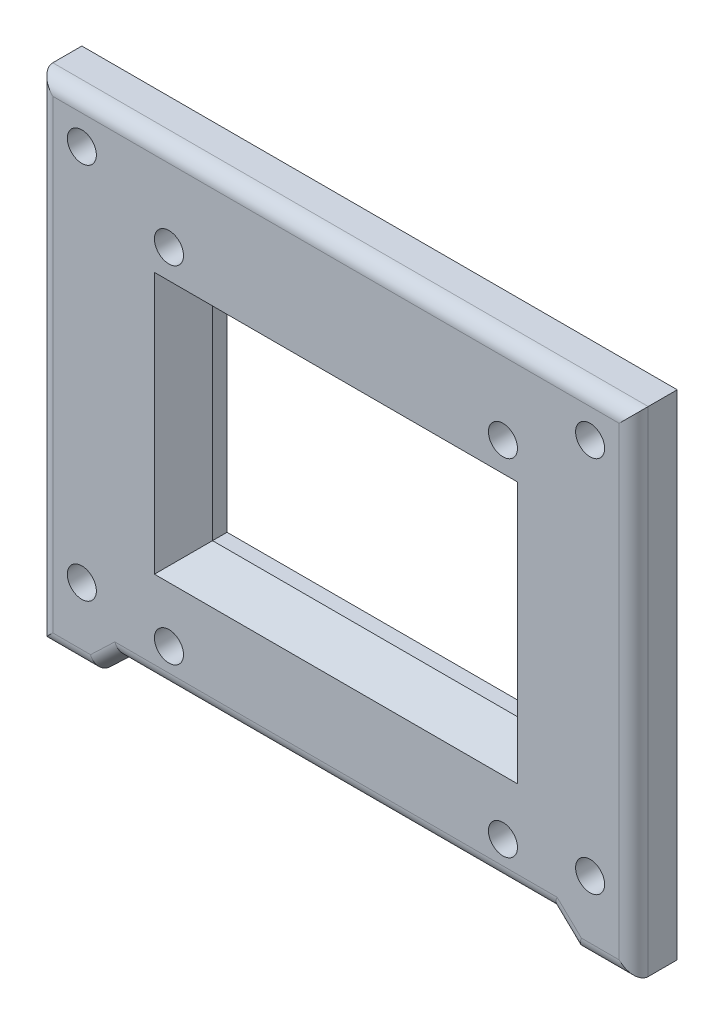
ISO-10303-21;
HEADER;
FILE_DESCRIPTION(('STEP AP214'),'2;1');
FILE_NAME('part.step','',(''),(''),'','','');
FILE_SCHEMA(('AUTOMOTIVE_DESIGN { 1 0 10303 214 1 1 1 1 }'));
ENDSEC;
DATA;
#1=APPLICATION_CONTEXT('core data for automotive mechanical design processes');
#2=APPLICATION_PROTOCOL_DEFINITION('international standard','automotive_design',2000,#1);
#3=PRODUCT_CONTEXT('',#1,'mechanical');
#4=PRODUCT('Part','Part','',(#3));
#5=PRODUCT_RELATED_PRODUCT_CATEGORY('part','',(#4));
#6=PRODUCT_DEFINITION_FORMATION('','',#4);
#7=PRODUCT_DEFINITION_CONTEXT('part definition',#1,'design');
#8=PRODUCT_DEFINITION('design','',#6,#7);
#9=PRODUCT_DEFINITION_SHAPE('','',#8);
#10=(LENGTH_UNIT() NAMED_UNIT(*) SI_UNIT(.MILLI.,.METRE.));
#11=(NAMED_UNIT(*) PLANE_ANGLE_UNIT() SI_UNIT($,.RADIAN.));
#12=(NAMED_UNIT(*) SI_UNIT($,.STERADIAN.) SOLID_ANGLE_UNIT());
#13=UNCERTAINTY_MEASURE_WITH_UNIT(LENGTH_MEASURE(1.E-05),#10,'distance_accuracy_value','');
#14=(GEOMETRIC_REPRESENTATION_CONTEXT(3) GLOBAL_UNCERTAINTY_ASSIGNED_CONTEXT((#13)) GLOBAL_UNIT_ASSIGNED_CONTEXT((#10,
#11,#12)) REPRESENTATION_CONTEXT('',''));
#15=CARTESIAN_POINT('',(0.,0.,0.));
#16=DIRECTION('',(0.,0.,1.));
#17=DIRECTION('',(1.,0.,0.));
#18=AXIS2_PLACEMENT_3D('',#15,#16,#17);
#19=CARTESIAN_POINT('',(0.,0.,3.));
#20=DIRECTION('',(0.,0.,1.));
#21=DIRECTION('',(1.,0.,0.));
#22=AXIS2_PLACEMENT_3D('',#19,#20,#21);
#23=PLANE('',#22);
#24=CARTESIAN_POINT('',(-18.4283511042773,-4.09303737255482,3.));
#25=DIRECTION('',(0.,0.,1.));
#26=DIRECTION('',(1.,0.,0.));
#27=AXIS2_PLACEMENT_3D('',#24,#25,#26);
#28=CIRCLE('',#27,1.);
#29=CARTESIAN_POINT('',(-17.4283511042773,-4.09303737255482,3.));
#30=VERTEX_POINT('',#29);
#31=EDGE_CURVE('E772',#30,#30,#28,.T.);
#32=ORIENTED_EDGE('',*,*,#31,.F.);
#33=EDGE_LOOP('',(#32));
#34=FACE_BOUND('',#33,.T.);
#35=CARTESIAN_POINT('',(16.5716488957227,21.9069626274452,3.));
#36=DIRECTION('',(0.,0.,1.));
#37=DIRECTION('',(1.,0.,0.));
#38=AXIS2_PLACEMENT_3D('',#35,#36,#37);
#39=CIRCLE('',#38,1.);
#40=CARTESIAN_POINT('',(17.5716488957227,21.9069626274452,3.));
#41=VERTEX_POINT('',#40);
#42=EDGE_CURVE('E781',#41,#41,#39,.T.);
#43=ORIENTED_EDGE('',*,*,#42,.F.);
#44=EDGE_LOOP('',(#43));
#45=FACE_BOUND('',#44,.T.);
#46=CARTESIAN_POINT('',(16.5716488957227,-4.09303737255482,3.));
#47=DIRECTION('',(0.,0.,1.));
#48=DIRECTION('',(1.,0.,0.));
#49=AXIS2_PLACEMENT_3D('',#46,#47,#48);
#50=CIRCLE('',#49,1.);
#51=CARTESIAN_POINT('',(17.5716488957227,-4.09303737255482,3.));
#52=VERTEX_POINT('',#51);
#53=EDGE_CURVE('E847',#52,#52,#50,.T.);
#54=ORIENTED_EDGE('',*,*,#53,.F.);
#55=EDGE_LOOP('',(#54));
#56=FACE_BOUND('',#55,.T.);
#57=CARTESIAN_POINT('',(-18.4283511042773,21.9069626274452,3.));
#58=DIRECTION('',(0.,0.,1.));
#59=DIRECTION('',(1.,0.,0.));
#60=AXIS2_PLACEMENT_3D('',#57,#58,#59);
#61=CIRCLE('',#60,1.);
#62=CARTESIAN_POINT('',(-17.4283511042773,21.9069626274452,3.));
#63=VERTEX_POINT('',#62);
#64=EDGE_CURVE('E778',#63,#63,#61,.T.);
#65=ORIENTED_EDGE('',*,*,#64,.F.);
#66=EDGE_LOOP('',(#65));
#67=FACE_BOUND('',#66,.T.);
#68=DIRECTION('',(0.722490361505851,0.691380993035783,0.));
#69=VECTOR('',#68,1.);
#70=CARTESIAN_POINT('',(-16.4477385220579,-6.77054701104897,3.));
#71=LINE('',#70,#69);
#72=CARTESIAN_POINT('',(-17.8297356394171,-8.09303737255482,3.));
#73=VERTEX_POINT('',#72);
#74=CARTESIAN_POINT('',(-16.1577420641619,-6.49303737255482,3.));
#75=VERTEX_POINT('',#74);
#76=EDGE_CURVE('E325',#73,#75,#71,.T.);
#77=ORIENTED_EDGE('',*,*,#76,.T.);
#78=DIRECTION('',(1.,0.,0.));
#79=VECTOR('',#78,1.);
#80=CARTESIAN_POINT('',(13.8996553204676,-6.49303737255482,3.));
#81=LINE('',#80,#79);
#82=CARTESIAN_POINT('',(14.3010398556073,-6.49303737255482,3.));
#83=VERTEX_POINT('',#82);
#84=EDGE_CURVE('E332',#75,#83,#81,.T.);
#85=ORIENTED_EDGE('',*,*,#84,.T.);
#86=DIRECTION('',(0.722490361505851,-0.691380993035783,0.));
#87=VECTOR('',#86,1.);
#88=CARTESIAN_POINT('',(16.2630298887585,-8.37054701104897,3.));
#89=LINE('',#88,#87);
#90=CARTESIAN_POINT('',(15.9730334308625,-8.09303737255482,3.));
#91=VERTEX_POINT('',#90);
#92=EDGE_CURVE('E328',#83,#91,#89,.T.);
#93=ORIENTED_EDGE('',*,*,#92,.T.);
#94=DIRECTION('',(1.,0.,0.));
#95=VECTOR('',#94,1.);
#96=CARTESIAN_POINT('',(19.5716488957227,-8.09303737255483,3.));
#97=LINE('',#96,#95);
#98=CARTESIAN_POINT('',(18.5716488957227,-8.09303737255483,3.));
#99=VERTEX_POINT('',#98);
#100=EDGE_CURVE('E319',#91,#99,#97,.T.);
#101=ORIENTED_EDGE('',*,*,#100,.T.);
#102=DIRECTION('',(0.,1.,0.));
#103=VECTOR('',#102,1.);
#104=CARTESIAN_POINT('',(18.5716488957227,24.9069626274452,3.));
#105=LINE('',#104,#103);
#106=CARTESIAN_POINT('',(18.5716488957227,23.9069626274452,3.));
#107=VERTEX_POINT('',#106);
#108=EDGE_CURVE('E316',#99,#107,#105,.T.);
#109=ORIENTED_EDGE('',*,*,#108,.T.);
#110=DIRECTION('',(-1.,0.,0.));
#111=VECTOR('',#110,1.);
#112=CARTESIAN_POINT('',(-21.4283511042773,23.9069626274452,3.));
#113=LINE('',#112,#111);
#114=CARTESIAN_POINT('',(-20.4283511042773,23.9069626274452,3.));
#115=VERTEX_POINT('',#114);
#116=EDGE_CURVE('E313',#107,#115,#113,.T.);
#117=ORIENTED_EDGE('',*,*,#116,.T.);
#118=DIRECTION('',(0.,-1.,0.));
#119=VECTOR('',#118,1.);
#120=CARTESIAN_POINT('',(-20.4283511042773,-9.09303737255483,3.));
#121=LINE('',#120,#119);
#122=CARTESIAN_POINT('',(-20.4283511042773,-8.09303737255483,3.));
#123=VERTEX_POINT('',#122);
#124=EDGE_CURVE('E295',#115,#123,#121,.T.);
#125=ORIENTED_EDGE('',*,*,#124,.T.);
#126=DIRECTION('',(1.,0.,0.));
#127=VECTOR('',#126,1.);
#128=CARTESIAN_POINT('',(-17.4283511042773,-8.09303737255482,3.));
#129=LINE('',#128,#127);
#130=EDGE_CURVE('E322',#123,#73,#129,.T.);
#131=ORIENTED_EDGE('',*,*,#130,.T.);
#132=EDGE_LOOP('',(#77,#85,#93,#101,#109,#117,#125,#131));
#133=FACE_BOUND('',#132,.T.);
#134=DIRECTION('',(-1.,0.,0.));
#135=VECTOR('',#134,1.);
#136=CARTESIAN_POINT('',(0.,-1.09303737255483,3.));
#137=LINE('',#136,#135);
#138=CARTESIAN_POINT('',(11.5716488957227,-1.09303737255483,3.));
#139=VERTEX_POINT('',#138);
#140=CARTESIAN_POINT('',(-13.4283511042773,-1.09303737255483,3.));
#141=VERTEX_POINT('',#140);
#142=EDGE_CURVE('E273',#139,#141,#137,.T.);
#143=ORIENTED_EDGE('',*,*,#142,.T.);
#144=DIRECTION('',(0.,1.,0.));
#145=VECTOR('',#144,1.);
#146=CARTESIAN_POINT('',(-13.4283511042773,0.,3.));
#147=LINE('',#146,#145);
#148=CARTESIAN_POINT('',(-13.4283511042773,16.9069626274452,3.));
#149=VERTEX_POINT('',#148);
#150=EDGE_CURVE('E282',#141,#149,#147,.T.);
#151=ORIENTED_EDGE('',*,*,#150,.T.);
#152=DIRECTION('',(1.,0.,0.));
#153=VECTOR('',#152,1.);
#154=CARTESIAN_POINT('',(0.,16.9069626274452,3.));
#155=LINE('',#154,#153);
#156=CARTESIAN_POINT('',(11.5716488957227,16.9069626274452,3.));
#157=VERTEX_POINT('',#156);
#158=EDGE_CURVE('E279',#149,#157,#155,.T.);
#159=ORIENTED_EDGE('',*,*,#158,.T.);
#160=DIRECTION('',(0.,-1.,0.));
#161=VECTOR('',#160,1.);
#162=CARTESIAN_POINT('',(11.5716488957227,0.,3.));
#163=LINE('',#162,#161);
#164=EDGE_CURVE('E276',#157,#139,#163,.T.);
#165=ORIENTED_EDGE('',*,*,#164,.T.);
#166=EDGE_LOOP('',(#143,#151,#159,#165));
#167=FACE_BOUND('',#166,.T.);
#168=CARTESIAN_POINT('',(10.5716488957227,18.9069626274452,3.));
#169=DIRECTION('',(0.,0.,1.));
#170=DIRECTION('',(1.,0.,0.));
#171=AXIS2_PLACEMENT_3D('',#168,#169,#170);
#172=CIRCLE('',#171,1.);
#173=CARTESIAN_POINT('',(11.5716488957227,18.9069626274452,3.));
#174=VERTEX_POINT('',#173);
#175=EDGE_CURVE('E803',#174,#174,#172,.T.);
#176=ORIENTED_EDGE('',*,*,#175,.F.);
#177=EDGE_LOOP('',(#176));
#178=FACE_BOUND('',#177,.T.);
#179=CARTESIAN_POINT('',(-12.4283511042773,18.9069626274452,3.));
#180=DIRECTION('',(0.,0.,1.));
#181=DIRECTION('',(1.,0.,0.));
#182=AXIS2_PLACEMENT_3D('',#179,#180,#181);
#183=CIRCLE('',#182,1.);
#184=CARTESIAN_POINT('',(-11.4283511042773,18.9069626274452,3.));
#185=VERTEX_POINT('',#184);
#186=EDGE_CURVE('E196',#185,#185,#183,.T.);
#187=ORIENTED_EDGE('',*,*,#186,.F.);
#188=EDGE_LOOP('',(#187));
#189=FACE_BOUND('',#188,.T.);
#190=CARTESIAN_POINT('',(-12.4283511042773,-4.89303737255482,3.));
#191=DIRECTION('',(0.,0.,1.));
#192=DIRECTION('',(1.,0.,0.));
#193=AXIS2_PLACEMENT_3D('',#190,#191,#192);
#194=CIRCLE('',#193,1.);
#195=CARTESIAN_POINT('',(-11.4283511042773,-4.89303737255482,3.));
#196=VERTEX_POINT('',#195);
#197=EDGE_CURVE('E811',#196,#196,#194,.T.);
#198=ORIENTED_EDGE('',*,*,#197,.F.);
#199=EDGE_LOOP('',(#198));
#200=FACE_BOUND('',#199,.T.);
#201=CARTESIAN_POINT('',(10.5716488957227,-4.89303737255482,3.));
#202=DIRECTION('',(0.,0.,1.));
#203=DIRECTION('',(1.,0.,0.));
#204=AXIS2_PLACEMENT_3D('',#201,#202,#203);
#205=CIRCLE('',#204,1.);
#206=CARTESIAN_POINT('',(11.5716488957227,-4.89303737255482,3.));
#207=VERTEX_POINT('',#206);
#208=EDGE_CURVE('E795',#207,#207,#205,.T.);
#209=ORIENTED_EDGE('',*,*,#208,.F.);
#210=EDGE_LOOP('',(#209));
#211=FACE_BOUND('',#210,.T.);
#212=ADVANCED_FACE('F40',(#34,#45,#56,#67,#133,#167,#178,#189,#200,#211),#23,.T.);
#213=CARTESIAN_POINT('',(0.,0.,0.));
#214=DIRECTION('',(0.,0.,1.));
#215=DIRECTION('',(1.,0.,0.));
#216=AXIS2_PLACEMENT_3D('',#213,#214,#215);
#217=PLANE('',#216);
#218=CARTESIAN_POINT('',(-18.4283511042773,-4.09303737255482,0.));
#219=DIRECTION('',(0.,0.,1.));
#220=DIRECTION('',(1.,0.,0.));
#221=AXIS2_PLACEMENT_3D('',#218,#219,#220);
#222=CIRCLE('',#221,1.);
#223=CARTESIAN_POINT('',(-17.4283511042773,-4.09303737255482,0.));
#224=VERTEX_POINT('',#223);
#225=EDGE_CURVE('E770',#224,#224,#222,.T.);
#226=ORIENTED_EDGE('',*,*,#225,.T.);
#227=EDGE_LOOP('',(#226));
#228=FACE_BOUND('',#227,.T.);
#229=CARTESIAN_POINT('',(16.5716488957227,21.9069626274452,0.));
#230=DIRECTION('',(0.,0.,1.));
#231=DIRECTION('',(1.,0.,0.));
#232=AXIS2_PLACEMENT_3D('',#229,#230,#231);
#233=CIRCLE('',#232,1.);
#234=CARTESIAN_POINT('',(17.5716488957227,21.9069626274452,0.));
#235=VERTEX_POINT('',#234);
#236=EDGE_CURVE('E774',#235,#235,#233,.T.);
#237=ORIENTED_EDGE('',*,*,#236,.T.);
#238=EDGE_LOOP('',(#237));
#239=FACE_BOUND('',#238,.T.);
#240=CARTESIAN_POINT('',(16.5716488957227,-4.09303737255482,0.));
#241=DIRECTION('',(0.,0.,1.));
#242=DIRECTION('',(1.,0.,0.));
#243=AXIS2_PLACEMENT_3D('',#240,#241,#242);
#244=CIRCLE('',#243,1.);
#245=CARTESIAN_POINT('',(17.5716488957227,-4.09303737255482,0.));
#246=VERTEX_POINT('',#245);
#247=EDGE_CURVE('E788',#246,#246,#244,.T.);
#248=ORIENTED_EDGE('',*,*,#247,.T.);
#249=EDGE_LOOP('',(#248));
#250=FACE_BOUND('',#249,.T.);
#251=CARTESIAN_POINT('',(-18.4283511042773,21.9069626274452,0.));
#252=DIRECTION('',(0.,0.,1.));
#253=DIRECTION('',(1.,0.,0.));
#254=AXIS2_PLACEMENT_3D('',#251,#252,#253);
#255=CIRCLE('',#254,1.);
#256=CARTESIAN_POINT('',(-17.4283511042773,21.9069626274452,0.));
#257=VERTEX_POINT('',#256);
#258=EDGE_CURVE('E360',#257,#257,#255,.T.);
#259=ORIENTED_EDGE('',*,*,#258,.T.);
#260=EDGE_LOOP('',(#259));
#261=FACE_BOUND('',#260,.T.);
#262=DIRECTION('',(0.,-1.,0.));
#263=VECTOR('',#262,1.);
#264=CARTESIAN_POINT('',(-21.4283511042773,24.9069626274452,0.));
#265=LINE('',#264,#263);
#266=CARTESIAN_POINT('',(-21.4283511042773,24.9069626274452,0.));
#267=VERTEX_POINT('',#266);
#268=CARTESIAN_POINT('',(-21.4283511042773,-9.09303737255483,0.));
#269=VERTEX_POINT('',#268);
#270=EDGE_CURVE('E178',#267,#269,#265,.T.);
#271=ORIENTED_EDGE('',*,*,#270,.F.);
#272=DIRECTION('',(-1.,0.,0.));
#273=VECTOR('',#272,1.);
#274=CARTESIAN_POINT('',(-21.4283511042773,24.9069626274452,0.));
#275=LINE('',#274,#273);
#276=CARTESIAN_POINT('',(19.5716488957227,24.9069626274452,0.));
#277=VERTEX_POINT('',#276);
#278=EDGE_CURVE('E243',#277,#267,#275,.T.);
#279=ORIENTED_EDGE('',*,*,#278,.F.);
#280=DIRECTION('',(0.,1.,0.));
#281=VECTOR('',#280,1.);
#282=CARTESIAN_POINT('',(19.5716488957227,24.9069626274452,0.));
#283=LINE('',#282,#281);
#284=CARTESIAN_POINT('',(19.5716488957227,-9.09303737255483,0.));
#285=VERTEX_POINT('',#284);
#286=EDGE_CURVE('E239',#285,#277,#283,.T.);
#287=ORIENTED_EDGE('',*,*,#286,.F.);
#288=DIRECTION('',(1.,0.,0.));
#289=VECTOR('',#288,1.);
#290=CARTESIAN_POINT('',(17.6967719504283,-9.09303737255482,0.));
#291=LINE('',#290,#289);
#292=CARTESIAN_POINT('',(15.5716488957227,-9.09303737255482,0.));
#293=VERTEX_POINT('',#292);
#294=EDGE_CURVE('E235',#293,#285,#291,.T.);
#295=ORIENTED_EDGE('',*,*,#294,.F.);
#296=DIRECTION('',(0.722490361505851,-0.691380993035783,0.));
#297=VECTOR('',#296,1.);
#298=CARTESIAN_POINT('',(15.5716488957227,-9.09303737255482,0.));
#299=LINE('',#298,#297);
#300=CARTESIAN_POINT('',(13.8996553204676,-7.49303737255482,0.));
#301=VERTEX_POINT('',#300);
#302=EDGE_CURVE('E231',#301,#293,#299,.T.);
#303=ORIENTED_EDGE('',*,*,#302,.F.);
#304=DIRECTION('',(1.,0.,0.));
#305=VECTOR('',#304,1.);
#306=CARTESIAN_POINT('',(-15.7563575290221,-7.49303737255482,0.));
#307=LINE('',#306,#305);
#308=CARTESIAN_POINT('',(-15.7563575290221,-7.49303737255482,0.));
#309=VERTEX_POINT('',#308);
#310=EDGE_CURVE('E227',#309,#301,#307,.T.);
#311=ORIENTED_EDGE('',*,*,#310,.F.);
#312=DIRECTION('',(0.722490361505851,0.691380993035783,0.));
#313=VECTOR('',#312,1.);
#314=CARTESIAN_POINT('',(-17.4283511042773,-9.09303737255482,0.));
#315=LINE('',#314,#313);
#316=CARTESIAN_POINT('',(-17.4283511042773,-9.09303737255482,0.));
#317=VERTEX_POINT('',#316);
#318=EDGE_CURVE('E223',#317,#309,#315,.T.);
#319=ORIENTED_EDGE('',*,*,#318,.F.);
#320=DIRECTION('',(1.,0.,0.));
#321=VECTOR('',#320,1.);
#322=CARTESIAN_POINT('',(-21.4283511042773,-9.09303737255483,0.));
#323=LINE('',#322,#321);
#324=EDGE_CURVE('E219',#269,#317,#323,.T.);
#325=ORIENTED_EDGE('',*,*,#324,.F.);
#326=EDGE_LOOP('',(#271,#279,#287,#295,#303,#311,#319,#325));
#327=FACE_BOUND('',#326,.T.);
#328=DIRECTION('',(0.,-1.,0.));
#329=VECTOR('',#328,1.);
#330=CARTESIAN_POINT('',(-11.4283511042773,14.9069626274452,0.));
#331=LINE('',#330,#329);
#332=CARTESIAN_POINT('',(-11.4283511042773,14.9069626274452,0.));
#333=VERTEX_POINT('',#332);
#334=CARTESIAN_POINT('',(-11.4283511042773,0.906962627445175,0.));
#335=VERTEX_POINT('',#334);
#336=EDGE_CURVE('E172',#333,#335,#331,.T.);
#337=ORIENTED_EDGE('',*,*,#336,.T.);
#338=DIRECTION('',(1.,0.,0.));
#339=VECTOR('',#338,1.);
#340=CARTESIAN_POINT('',(-11.4283511042773,0.906962627445175,0.));
#341=LINE('',#340,#339);
#342=CARTESIAN_POINT('',(9.57164889572272,0.906962627445175,0.));
#343=VERTEX_POINT('',#342);
#344=EDGE_CURVE('E182',#335,#343,#341,.T.);
#345=ORIENTED_EDGE('',*,*,#344,.T.);
#346=DIRECTION('',(0.,1.,0.));
#347=VECTOR('',#346,1.);
#348=CARTESIAN_POINT('',(9.57164889572272,14.9069626274452,0.));
#349=LINE('',#348,#347);
#350=CARTESIAN_POINT('',(9.57164889572272,14.9069626274452,0.));
#351=VERTEX_POINT('',#350);
#352=EDGE_CURVE('E189',#343,#351,#349,.T.);
#353=ORIENTED_EDGE('',*,*,#352,.T.);
#354=DIRECTION('',(-1.,0.,0.));
#355=VECTOR('',#354,1.);
#356=CARTESIAN_POINT('',(-11.4283511042773,14.9069626274452,0.));
#357=LINE('',#356,#355);
#358=EDGE_CURVE('E194',#351,#333,#357,.T.);
#359=ORIENTED_EDGE('',*,*,#358,.T.);
#360=EDGE_LOOP('',(#337,#345,#353,#359));
#361=FACE_BOUND('',#360,.T.);
#362=CARTESIAN_POINT('',(-12.4283511042773,18.9069626274452,0.));
#363=DIRECTION('',(0.,0.,1.));
#364=DIRECTION('',(1.,0.,0.));
#365=AXIS2_PLACEMENT_3D('',#362,#363,#364);
#366=CIRCLE('',#365,1.);
#367=CARTESIAN_POINT('',(-11.4283511042773,18.9069626274452,0.));
#368=VERTEX_POINT('',#367);
#369=EDGE_CURVE('E200',#368,#368,#366,.T.);
#370=ORIENTED_EDGE('',*,*,#369,.T.);
#371=EDGE_LOOP('',(#370));
#372=FACE_BOUND('',#371,.T.);
#373=CARTESIAN_POINT('',(-12.4283511042773,-4.89303737255482,0.));
#374=DIRECTION('',(0.,0.,1.));
#375=DIRECTION('',(1.,0.,0.));
#376=AXIS2_PLACEMENT_3D('',#373,#374,#375);
#377=CIRCLE('',#376,1.);
#378=CARTESIAN_POINT('',(-11.4283511042773,-4.89303737255482,0.));
#379=VERTEX_POINT('',#378);
#380=EDGE_CURVE('E807',#379,#379,#377,.T.);
#381=ORIENTED_EDGE('',*,*,#380,.T.);
#382=EDGE_LOOP('',(#381));
#383=FACE_BOUND('',#382,.T.);
#384=CARTESIAN_POINT('',(10.5716488957227,18.9069626274452,0.));
#385=DIRECTION('',(0.,0.,1.));
#386=DIRECTION('',(1.,0.,0.));
#387=AXIS2_PLACEMENT_3D('',#384,#385,#386);
#388=CIRCLE('',#387,1.);
#389=CARTESIAN_POINT('',(11.5716488957227,18.9069626274452,0.));
#390=VERTEX_POINT('',#389);
#391=EDGE_CURVE('E799',#390,#390,#388,.T.);
#392=ORIENTED_EDGE('',*,*,#391,.T.);
#393=EDGE_LOOP('',(#392));
#394=FACE_BOUND('',#393,.T.);
#395=CARTESIAN_POINT('',(10.5716488957227,-4.89303737255482,0.));
#396=DIRECTION('',(0.,0.,1.));
#397=DIRECTION('',(1.,0.,0.));
#398=AXIS2_PLACEMENT_3D('',#395,#396,#397);
#399=CIRCLE('',#398,1.);
#400=CARTESIAN_POINT('',(11.5716488957227,-4.89303737255482,0.));
#401=VERTEX_POINT('',#400);
#402=EDGE_CURVE('E310',#401,#401,#399,.T.);
#403=ORIENTED_EDGE('',*,*,#402,.T.);
#404=EDGE_LOOP('',(#403));
#405=FACE_BOUND('',#404,.T.);
#406=ADVANCED_FACE('F191',(#228,#239,#250,#261,#327,#361,#372,#383,#394,#405),#217,.F.);
#407=CARTESIAN_POINT('',(-21.4283511042773,24.9069626274452,3.));
#408=DIRECTION('',(1.,0.,0.));
#409=DIRECTION('',(0.,0.,-1.));
#410=AXIS2_PLACEMENT_3D('',#407,#408,#409);
#411=PLANE('',#410);
#412=DIRECTION('',(0.,0.,-1.));
#413=VECTOR('',#412,1.);
#414=CARTESIAN_POINT('',(-21.4283511042773,-9.09303737255483,3.));
#415=LINE('',#414,#413);
#416=CARTESIAN_POINT('',(-21.4283511042773,-9.09303737255483,2.));
#417=VERTEX_POINT('',#416);
#418=EDGE_CURVE('E268',#417,#269,#415,.T.);
#419=ORIENTED_EDGE('',*,*,#418,.F.);
#420=DIRECTION('',(0.,-1.,0.));
#421=VECTOR('',#420,1.);
#422=CARTESIAN_POINT('',(-21.4283511042773,24.9069626274452,2.));
#423=LINE('',#422,#421);
#424=CARTESIAN_POINT('',(-21.4283511042773,24.9069626274452,2.));
#425=VERTEX_POINT('',#424);
#426=EDGE_CURVE('E11',#417,#425,#423,.F.);
#427=ORIENTED_EDGE('',*,*,#426,.T.);
#428=DIRECTION('',(0.,0.,-1.));
#429=VECTOR('',#428,1.);
#430=CARTESIAN_POINT('',(-21.4283511042773,24.9069626274452,3.));
#431=LINE('',#430,#429);
#432=EDGE_CURVE('E247',#425,#267,#431,.T.);
#433=ORIENTED_EDGE('',*,*,#432,.T.);
#434=ORIENTED_EDGE('',*,*,#270,.T.);
#435=EDGE_LOOP('',(#419,#427,#433,#434));
#436=FACE_BOUND('',#435,.T.);
#437=ADVANCED_FACE('F416',(#436),#411,.F.);
#438=CARTESIAN_POINT('',(-21.4283511042773,-9.09303737255483,3.));
#439=DIRECTION('',(0.,1.,0.));
#440=DIRECTION('',(-1.,0.,0.));
#441=AXIS2_PLACEMENT_3D('',#438,#439,#440);
#442=PLANE('',#441);
#443=DIRECTION('',(0.,0.,-1.));
#444=VECTOR('',#443,1.);
#445=CARTESIAN_POINT('',(-17.4283511042773,-9.09303737255482,3.));
#446=LINE('',#445,#444);
#447=CARTESIAN_POINT('',(-17.4283511042773,-9.09303737255482,2.));
#448=VERTEX_POINT('',#447);
#449=EDGE_CURVE('E265',#448,#317,#446,.T.);
#450=ORIENTED_EDGE('',*,*,#449,.F.);
#451=DIRECTION('',(1.,0.,0.));
#452=VECTOR('',#451,1.);
#453=CARTESIAN_POINT('',(-21.4283511042773,-9.09303737255483,2.));
#454=LINE('',#453,#452);
#455=EDGE_CURVE('E342',#448,#417,#454,.F.);
#456=ORIENTED_EDGE('',*,*,#455,.T.);
#457=ORIENTED_EDGE('',*,*,#418,.T.);
#458=ORIENTED_EDGE('',*,*,#324,.T.);
#459=EDGE_LOOP('',(#450,#456,#457,#458));
#460=FACE_BOUND('',#459,.T.);
#461=ADVANCED_FACE('F419',(#460),#442,.F.);
#462=CARTESIAN_POINT('',(-17.4283511042773,-9.09303737255482,3.));
#463=DIRECTION('',(-0.691380993035783,0.722490361505851,0.));
#464=DIRECTION('',(-0.722490361505851,-0.691380993035783,0.));
#465=AXIS2_PLACEMENT_3D('',#462,#463,#464);
#466=PLANE('',#465);
#467=DIRECTION('',(0.,0.,-1.));
#468=VECTOR('',#467,1.);
#469=CARTESIAN_POINT('',(-15.7563575290221,-7.49303737255482,3.));
#470=LINE('',#469,#468);
#471=CARTESIAN_POINT('',(-15.7563575290221,-7.49303737255482,2.));
#472=VERTEX_POINT('',#471);
#473=EDGE_CURVE('E262',#472,#309,#470,.T.);
#474=ORIENTED_EDGE('',*,*,#473,.F.);
#475=DIRECTION('',(0.722490361505851,0.691380993035783,0.));
#476=VECTOR('',#475,1.);
#477=CARTESIAN_POINT('',(-17.4283511042773,-9.09303737255482,2.));
#478=LINE('',#477,#476);
#479=EDGE_CURVE('E339',#472,#448,#478,.F.);
#480=ORIENTED_EDGE('',*,*,#479,.T.);
#481=ORIENTED_EDGE('',*,*,#449,.T.);
#482=ORIENTED_EDGE('',*,*,#318,.T.);
#483=EDGE_LOOP('',(#474,#480,#481,#482));
#484=FACE_BOUND('',#483,.T.);
#485=ADVANCED_FACE('F424',(#484),#466,.F.);
#486=CARTESIAN_POINT('',(-15.7563575290221,-7.49303737255482,3.));
#487=DIRECTION('',(0.,1.,0.));
#488=DIRECTION('',(0.,0.,1.));
#489=AXIS2_PLACEMENT_3D('',#486,#487,#488);
#490=PLANE('',#489);
#491=DIRECTION('',(0.,0.,-1.));
#492=VECTOR('',#491,1.);
#493=CARTESIAN_POINT('',(13.8996553204676,-7.49303737255482,3.));
#494=LINE('',#493,#492);
#495=CARTESIAN_POINT('',(13.8996553204676,-7.49303737255482,2.));
#496=VERTEX_POINT('',#495);
#497=EDGE_CURVE('E259',#496,#301,#494,.T.);
#498=ORIENTED_EDGE('',*,*,#497,.F.);
#499=DIRECTION('',(1.,0.,0.));
#500=VECTOR('',#499,1.);
#501=CARTESIAN_POINT('',(-15.7563575290221,-7.49303737255482,2.));
#502=LINE('',#501,#500);
#503=EDGE_CURVE('E345',#496,#472,#502,.F.);
#504=ORIENTED_EDGE('',*,*,#503,.T.);
#505=ORIENTED_EDGE('',*,*,#473,.T.);
#506=ORIENTED_EDGE('',*,*,#310,.T.);
#507=EDGE_LOOP('',(#498,#504,#505,#506));
#508=FACE_BOUND('',#507,.T.);
#509=ADVANCED_FACE('F449',(#508),#490,.F.);
#510=CARTESIAN_POINT('',(15.5716488957227,-9.09303737255482,3.));
#511=DIRECTION('',(0.691380993035783,0.722490361505851,0.));
#512=DIRECTION('',(-0.722490361505851,0.691380993035783,0.));
#513=AXIS2_PLACEMENT_3D('',#510,#511,#512);
#514=PLANE('',#513);
#515=DIRECTION('',(0.,0.,-1.));
#516=VECTOR('',#515,1.);
#517=CARTESIAN_POINT('',(15.5716488957227,-9.09303737255482,3.));
#518=LINE('',#517,#516);
#519=CARTESIAN_POINT('',(15.5716488957227,-9.09303737255482,2.));
#520=VERTEX_POINT('',#519);
#521=EDGE_CURVE('E256',#520,#293,#518,.T.);
#522=ORIENTED_EDGE('',*,*,#521,.F.);
#523=DIRECTION('',(0.722490361505851,-0.691380993035783,0.));
#524=VECTOR('',#523,1.);
#525=CARTESIAN_POINT('',(13.8996553204676,-7.49303737255482,2.));
#526=LINE('',#525,#524);
#527=EDGE_CURVE('E335',#520,#496,#526,.F.);
#528=ORIENTED_EDGE('',*,*,#527,.T.);
#529=ORIENTED_EDGE('',*,*,#497,.T.);
#530=ORIENTED_EDGE('',*,*,#302,.T.);
#531=EDGE_LOOP('',(#522,#528,#529,#530));
#532=FACE_BOUND('',#531,.T.);
#533=ADVANCED_FACE('F447',(#532),#514,.F.);
#534=CARTESIAN_POINT('',(17.6967719504283,-9.09303737255482,3.));
#535=DIRECTION('',(0.,1.,0.));
#536=DIRECTION('',(-1.,0.,0.));
#537=AXIS2_PLACEMENT_3D('',#534,#535,#536);
#538=PLANE('',#537);
#539=DIRECTION('',(0.,0.,-1.));
#540=VECTOR('',#539,1.);
#541=CARTESIAN_POINT('',(19.5716488957227,-9.09303737255483,3.));
#542=LINE('',#541,#540);
#543=CARTESIAN_POINT('',(19.5716488957227,-9.09303737255483,2.));
#544=VERTEX_POINT('',#543);
#545=EDGE_CURVE('E253',#544,#285,#542,.T.);
#546=ORIENTED_EDGE('',*,*,#545,.F.);
#547=DIRECTION('',(1.,0.,0.));
#548=VECTOR('',#547,1.);
#549=CARTESIAN_POINT('',(15.5716488957227,-9.09303737255482,2.));
#550=LINE('',#549,#548);
#551=EDGE_CURVE('E348',#544,#520,#550,.F.);
#552=ORIENTED_EDGE('',*,*,#551,.T.);
#553=ORIENTED_EDGE('',*,*,#521,.T.);
#554=ORIENTED_EDGE('',*,*,#294,.T.);
#555=EDGE_LOOP('',(#546,#552,#553,#554));
#556=FACE_BOUND('',#555,.T.);
#557=ADVANCED_FACE('F406',(#556),#538,.F.);
#558=CARTESIAN_POINT('',(19.5716488957227,24.9069626274452,3.));
#559=DIRECTION('',(-1.,0.,0.));
#560=DIRECTION('',(0.,0.,1.));
#561=AXIS2_PLACEMENT_3D('',#558,#559,#560);
#562=PLANE('',#561);
#563=DIRECTION('',(0.,0.,-1.));
#564=VECTOR('',#563,1.);
#565=CARTESIAN_POINT('',(19.5716488957227,24.9069626274452,3.));
#566=LINE('',#565,#564);
#567=CARTESIAN_POINT('',(19.5716488957227,24.9069626274452,2.));
#568=VERTEX_POINT('',#567);
#569=EDGE_CURVE('E250',#568,#277,#566,.T.);
#570=ORIENTED_EDGE('',*,*,#569,.F.);
#571=DIRECTION('',(0.,1.,0.));
#572=VECTOR('',#571,1.);
#573=CARTESIAN_POINT('',(19.5716488957227,-9.09303737255483,2.));
#574=LINE('',#573,#572);
#575=EDGE_CURVE('E351',#568,#544,#574,.F.);
#576=ORIENTED_EDGE('',*,*,#575,.T.);
#577=ORIENTED_EDGE('',*,*,#545,.T.);
#578=ORIENTED_EDGE('',*,*,#286,.T.);
#579=EDGE_LOOP('',(#570,#576,#577,#578));
#580=FACE_BOUND('',#579,.T.);
#581=ADVANCED_FACE('F404',(#580),#562,.F.);
#582=CARTESIAN_POINT('',(-21.4283511042773,24.9069626274452,3.));
#583=DIRECTION('',(0.,-1.,0.));
#584=DIRECTION('',(1.,0.,0.));
#585=AXIS2_PLACEMENT_3D('',#582,#583,#584);
#586=PLANE('',#585);
#587=ORIENTED_EDGE('',*,*,#432,.F.);
#588=DIRECTION('',(-1.,0.,0.));
#589=VECTOR('',#588,1.);
#590=CARTESIAN_POINT('',(19.5716488957227,24.9069626274452,2.));
#591=LINE('',#590,#589);
#592=EDGE_CURVE('E50',#425,#568,#591,.F.);
#593=ORIENTED_EDGE('',*,*,#592,.T.);
#594=ORIENTED_EDGE('',*,*,#569,.T.);
#595=ORIENTED_EDGE('',*,*,#278,.T.);
#596=EDGE_LOOP('',(#587,#593,#594,#595));
#597=FACE_BOUND('',#596,.T.);
#598=ADVANCED_FACE('F415',(#597),#586,.F.);
#599=CARTESIAN_POINT('',(-11.4283511042773,14.9069626274452,3.));
#600=DIRECTION('',(1.,0.,0.));
#601=DIRECTION('',(0.,0.,-1.));
#602=AXIS2_PLACEMENT_3D('',#599,#600,#601);
#603=PLANE('',#602);
#604=DIRECTION('',(0.,0.,-1.));
#605=VECTOR('',#604,1.);
#606=CARTESIAN_POINT('',(-11.4283511042773,14.9069626274452,3.));
#607=LINE('',#606,#605);
#608=CARTESIAN_POINT('',(-11.4283511042773,14.9069626274452,1.00000000000001));
#609=VERTEX_POINT('',#608);
#610=EDGE_CURVE('E208',#609,#333,#607,.T.);
#611=ORIENTED_EDGE('',*,*,#610,.F.);
#612=DIRECTION('',(0.,-1.,0.));
#613=VECTOR('',#612,1.);
#614=CARTESIAN_POINT('',(-11.4283511042773,14.9069626274452,1.00000000000001));
#615=LINE('',#614,#613);
#616=CARTESIAN_POINT('',(-11.4283511042773,0.906962627445175,1.00000000000001));
#617=VERTEX_POINT('',#616);
#618=EDGE_CURVE('E175',#609,#617,#615,.T.);
#619=ORIENTED_EDGE('',*,*,#618,.T.);
#620=DIRECTION('',(0.,0.,-1.));
#621=VECTOR('',#620,1.);
#622=CARTESIAN_POINT('',(-11.4283511042773,0.906962627445175,3.));
#623=LINE('',#622,#621);
#624=EDGE_CURVE('E167',#617,#335,#623,.T.);
#625=ORIENTED_EDGE('',*,*,#624,.T.);
#626=ORIENTED_EDGE('',*,*,#336,.F.);
#627=EDGE_LOOP('',(#611,#619,#625,#626));
#628=FACE_BOUND('',#627,.T.);
#629=ADVANCED_FACE('F170',(#628),#603,.T.);
#630=CARTESIAN_POINT('',(-11.4283511042773,0.906962627445175,3.));
#631=DIRECTION('',(0.,1.,0.));
#632=DIRECTION('',(0.,0.,1.));
#633=AXIS2_PLACEMENT_3D('',#630,#631,#632);
#634=PLANE('',#633);
#635=ORIENTED_EDGE('',*,*,#624,.F.);
#636=DIRECTION('',(1.,0.,0.));
#637=VECTOR('',#636,1.);
#638=CARTESIAN_POINT('',(-11.4283511042773,0.906962627445175,1.00000000000001));
#639=LINE('',#638,#637);
#640=CARTESIAN_POINT('',(9.57164889572272,0.906962627445175,1.00000000000001));
#641=VERTEX_POINT('',#640);
#642=EDGE_CURVE('E292',#617,#641,#639,.T.);
#643=ORIENTED_EDGE('',*,*,#642,.T.);
#644=DIRECTION('',(0.,0.,-1.));
#645=VECTOR('',#644,1.);
#646=CARTESIAN_POINT('',(9.57164889572272,0.906962627445175,3.));
#647=LINE('',#646,#645);
#648=EDGE_CURVE('E179',#641,#343,#647,.T.);
#649=ORIENTED_EDGE('',*,*,#648,.T.);
#650=ORIENTED_EDGE('',*,*,#344,.F.);
#651=EDGE_LOOP('',(#635,#643,#649,#650));
#652=FACE_BOUND('',#651,.T.);
#653=ADVANCED_FACE('F183',(#652),#634,.T.);
#654=CARTESIAN_POINT('',(9.57164889572272,14.9069626274452,3.));
#655=DIRECTION('',(-1.,0.,0.));
#656=DIRECTION('',(0.,0.,1.));
#657=AXIS2_PLACEMENT_3D('',#654,#655,#656);
#658=PLANE('',#657);
#659=ORIENTED_EDGE('',*,*,#648,.F.);
#660=DIRECTION('',(0.,1.,0.));
#661=VECTOR('',#660,1.);
#662=CARTESIAN_POINT('',(9.57164889572272,14.9069626274452,1.00000000000001));
#663=LINE('',#662,#661);
#664=CARTESIAN_POINT('',(9.57164889572272,14.9069626274452,1.00000000000001));
#665=VERTEX_POINT('',#664);
#666=EDGE_CURVE('E289',#641,#665,#663,.T.);
#667=ORIENTED_EDGE('',*,*,#666,.T.);
#668=DIRECTION('',(0.,0.,-1.));
#669=VECTOR('',#668,1.);
#670=CARTESIAN_POINT('',(9.57164889572272,14.9069626274452,3.));
#671=LINE('',#670,#669);
#672=EDGE_CURVE('E211',#665,#351,#671,.T.);
#673=ORIENTED_EDGE('',*,*,#672,.T.);
#674=ORIENTED_EDGE('',*,*,#352,.F.);
#675=EDGE_LOOP('',(#659,#667,#673,#674));
#676=FACE_BOUND('',#675,.T.);
#677=ADVANCED_FACE('F501',(#676),#658,.T.);
#678=CARTESIAN_POINT('',(-11.4283511042773,14.9069626274452,3.));
#679=DIRECTION('',(0.,-1.,0.));
#680=DIRECTION('',(0.,0.,-1.));
#681=AXIS2_PLACEMENT_3D('',#678,#679,#680);
#682=PLANE('',#681);
#683=ORIENTED_EDGE('',*,*,#672,.F.);
#684=DIRECTION('',(-1.,0.,0.));
#685=VECTOR('',#684,1.);
#686=CARTESIAN_POINT('',(-11.4283511042773,14.9069626274452,1.00000000000001));
#687=LINE('',#686,#685);
#688=EDGE_CURVE('E286',#665,#609,#687,.T.);
#689=ORIENTED_EDGE('',*,*,#688,.T.);
#690=ORIENTED_EDGE('',*,*,#610,.T.);
#691=ORIENTED_EDGE('',*,*,#358,.F.);
#692=EDGE_LOOP('',(#683,#689,#690,#691));
#693=FACE_BOUND('',#692,.T.);
#694=ADVANCED_FACE('F507',(#693),#682,.T.);
#695=CARTESIAN_POINT('',(-12.4283511042773,18.9069626274452,3.));
#696=DIRECTION('',(0.,0.,-1.));
#697=DIRECTION('',(-1.,0.,0.));
#698=AXIS2_PLACEMENT_3D('',#695,#696,#697);
#699=CYLINDRICAL_SURFACE('',#698,1.);
#700=ORIENTED_EDGE('',*,*,#186,.T.);
#701=EDGE_LOOP('',(#700));
#702=FACE_BOUND('',#701,.T.);
#703=ORIENTED_EDGE('',*,*,#369,.F.);
#704=EDGE_LOOP('',(#703));
#705=FACE_BOUND('',#704,.T.);
#706=ADVANCED_FACE('F515',(#702,#705),#699,.F.);
#707=CARTESIAN_POINT('',(-12.4283511042773,-4.89303737255482,3.));
#708=DIRECTION('',(0.,0.,-1.));
#709=DIRECTION('',(-1.,0.,0.));
#710=AXIS2_PLACEMENT_3D('',#707,#708,#709);
#711=CYLINDRICAL_SURFACE('',#710,1.);
#712=ORIENTED_EDGE('',*,*,#197,.T.);
#713=EDGE_LOOP('',(#712));
#714=FACE_BOUND('',#713,.T.);
#715=ORIENTED_EDGE('',*,*,#380,.F.);
#716=EDGE_LOOP('',(#715));
#717=FACE_BOUND('',#716,.T.);
#718=ADVANCED_FACE('F524',(#714,#717),#711,.F.);
#719=CARTESIAN_POINT('',(10.5716488957227,18.9069626274452,3.));
#720=DIRECTION('',(0.,0.,-1.));
#721=DIRECTION('',(-1.,0.,0.));
#722=AXIS2_PLACEMENT_3D('',#719,#720,#721);
#723=CYLINDRICAL_SURFACE('',#722,1.);
#724=ORIENTED_EDGE('',*,*,#175,.T.);
#725=EDGE_LOOP('',(#724));
#726=FACE_BOUND('',#725,.T.);
#727=ORIENTED_EDGE('',*,*,#391,.F.);
#728=EDGE_LOOP('',(#727));
#729=FACE_BOUND('',#728,.T.);
#730=ADVANCED_FACE('F532',(#726,#729),#723,.F.);
#731=CARTESIAN_POINT('',(10.5716488957227,-4.89303737255482,3.));
#732=DIRECTION('',(0.,0.,-1.));
#733=DIRECTION('',(-1.,0.,0.));
#734=AXIS2_PLACEMENT_3D('',#731,#732,#733);
#735=CYLINDRICAL_SURFACE('',#734,1.);
#736=ORIENTED_EDGE('',*,*,#208,.T.);
#737=EDGE_LOOP('',(#736));
#738=FACE_BOUND('',#737,.T.);
#739=ORIENTED_EDGE('',*,*,#402,.F.);
#740=EDGE_LOOP('',(#739));
#741=FACE_BOUND('',#740,.T.);
#742=ADVANCED_FACE('F540',(#738,#741),#735,.F.);
#743=CARTESIAN_POINT('',(9.57164889572272,14.9069626274452,1.00000000000001));
#744=DIRECTION('',(0.707106781186546,0.,-0.707106781186549));
#745=DIRECTION('',(0.,1.,0.));
#746=AXIS2_PLACEMENT_3D('',#743,#744,#745);
#747=PLANE('',#746);
#748=DIRECTION('',(-0.577350269189627,0.577350269189627,-0.577350269189624));
#749=VECTOR('',#748,1.);
#750=CARTESIAN_POINT('',(4.90498222905604,5.57362929411185,-3.66666666666666));
#751=LINE('',#750,#749);
#752=EDGE_CURVE('E302',#139,#641,#751,.T.);
#753=ORIENTED_EDGE('',*,*,#752,.F.);
#754=ORIENTED_EDGE('',*,*,#164,.F.);
#755=DIRECTION('',(-0.577350269189627,-0.577350269189627,-0.577350269189624));
#756=VECTOR('',#755,1.);
#757=CARTESIAN_POINT('',(2.5716488957227,7.90696262744516,-5.99999999999999));
#758=LINE('',#757,#756);
#759=EDGE_CURVE('E306',#665,#157,#758,.F.);
#760=ORIENTED_EDGE('',*,*,#759,.F.);
#761=ORIENTED_EDGE('',*,*,#666,.F.);
#762=EDGE_LOOP('',(#753,#754,#760,#761));
#763=FACE_BOUND('',#762,.T.);
#764=ADVANCED_FACE('F547',(#763),#747,.F.);
#765=CARTESIAN_POINT('',(-11.4283511042773,14.9069626274452,1.00000000000001));
#766=DIRECTION('',(0.,0.707106781186546,-0.707106781186549));
#767=DIRECTION('',(-1.,0.,0.));
#768=AXIS2_PLACEMENT_3D('',#765,#766,#767);
#769=PLANE('',#768);
#770=ORIENTED_EDGE('',*,*,#759,.T.);
#771=ORIENTED_EDGE('',*,*,#158,.F.);
#772=DIRECTION('',(0.577350269189627,-0.577350269189627,-0.577350269189624));
#773=VECTOR('',#772,1.);
#774=CARTESIAN_POINT('',(-11.4283511042773,14.9069626274452,1.00000000000001));
#775=LINE('',#774,#773);
#776=EDGE_CURVE('E299',#609,#149,#775,.F.);
#777=ORIENTED_EDGE('',*,*,#776,.F.);
#778=ORIENTED_EDGE('',*,*,#688,.F.);
#779=EDGE_LOOP('',(#770,#771,#777,#778));
#780=FACE_BOUND('',#779,.T.);
#781=ADVANCED_FACE('F554',(#780),#769,.F.);
#782=CARTESIAN_POINT('',(-11.4283511042773,0.906962627445175,1.00000000000001));
#783=DIRECTION('',(0.,-0.707106781186546,-0.707106781186549));
#784=DIRECTION('',(1.,0.,0.));
#785=AXIS2_PLACEMENT_3D('',#782,#783,#784);
#786=PLANE('',#785);
#787=ORIENTED_EDGE('',*,*,#752,.T.);
#788=ORIENTED_EDGE('',*,*,#642,.F.);
#789=DIRECTION('',(-0.577350269189627,-0.577350269189627,0.577350269189624));
#790=VECTOR('',#789,1.);
#791=CARTESIAN_POINT('',(-6.7616844376106,5.57362929411185,-3.66666666666666));
#792=LINE('',#791,#790);
#793=EDGE_CURVE('E296',#141,#617,#792,.F.);
#794=ORIENTED_EDGE('',*,*,#793,.F.);
#795=ORIENTED_EDGE('',*,*,#142,.F.);
#796=EDGE_LOOP('',(#787,#788,#794,#795));
#797=FACE_BOUND('',#796,.T.);
#798=ADVANCED_FACE('F562',(#797),#786,.F.);
#799=CARTESIAN_POINT('',(-11.4283511042773,14.9069626274452,1.00000000000001));
#800=DIRECTION('',(-0.707106781186546,0.,-0.707106781186549));
#801=DIRECTION('',(0.,-1.,0.));
#802=AXIS2_PLACEMENT_3D('',#799,#800,#801);
#803=PLANE('',#802);
#804=ORIENTED_EDGE('',*,*,#776,.T.);
#805=ORIENTED_EDGE('',*,*,#150,.F.);
#806=ORIENTED_EDGE('',*,*,#793,.T.);
#807=ORIENTED_EDGE('',*,*,#618,.F.);
#808=EDGE_LOOP('',(#804,#805,#806,#807));
#809=FACE_BOUND('',#808,.T.);
#810=ADVANCED_FACE('F570',(#809),#803,.F.);
#811=CARTESIAN_POINT('',(-20.4283511042773,0.,2.));
#812=DIRECTION('',(0.,1.,0.));
#813=DIRECTION('',(0.,0.,1.));
#814=AXIS2_PLACEMENT_3D('',#811,#812,#813);
#815=CYLINDRICAL_SURFACE('',#814,1.);
#816=CARTESIAN_POINT('',(-20.4283511042773,23.9069626274452,2.));
#817=DIRECTION('',(0.707106781186547,0.707106781186547,0.));
#818=DIRECTION('',(-0.707106781186548,0.707106781186547,0.));
#819=AXIS2_PLACEMENT_3D('',#816,#817,#818);
#820=ELLIPSE('',#819,1.41421356237309,1.);
#821=EDGE_CURVE('E378',#425,#115,#820,.T.);
#822=ORIENTED_EDGE('',*,*,#821,.F.);
#823=ORIENTED_EDGE('',*,*,#426,.F.);
#824=CARTESIAN_POINT('',(-20.4283511042773,-8.09303737255483,2.));
#825=DIRECTION('',(-0.707106781186548,0.707106781186547,0.));
#826=DIRECTION('',(0.707106781186547,0.707106781186548,0.));
#827=AXIS2_PLACEMENT_3D('',#824,#825,#826);
#828=ELLIPSE('',#827,1.4142135623731,1.);
#829=EDGE_CURVE('E44',#123,#417,#828,.F.);
#830=ORIENTED_EDGE('',*,*,#829,.F.);
#831=ORIENTED_EDGE('',*,*,#124,.F.);
#832=EDGE_LOOP('',(#822,#823,#830,#831));
#833=FACE_BOUND('',#832,.T.);
#834=ADVANCED_FACE('F42',(#833),#815,.T.);
#835=CARTESIAN_POINT('',(0.,-8.09303737255482,2.));
#836=DIRECTION('',(-1.,0.,0.));
#837=DIRECTION('',(0.,-1.,0.));
#838=AXIS2_PLACEMENT_3D('',#835,#836,#837);
#839=CYLINDRICAL_SURFACE('',#838,1.);
#840=ORIENTED_EDGE('',*,*,#829,.T.);
#841=ORIENTED_EDGE('',*,*,#455,.F.);
#842=CARTESIAN_POINT('',(-17.8297356394171,-8.09303737255483,2.));
#843=DIRECTION('',(-0.928032963182303,-0.372498079521324,0.));
#844=DIRECTION('',(-0.372498079521324,0.928032963182303,0.));
#845=AXIS2_PLACEMENT_3D('',#842,#843,#844);
#846=ELLIPSE('',#845,1.07754793167143,1.);
#847=EDGE_CURVE('E375',#73,#448,#846,.F.);
#848=ORIENTED_EDGE('',*,*,#847,.F.);
#849=ORIENTED_EDGE('',*,*,#130,.F.);
#850=EDGE_LOOP('',(#840,#841,#848,#849));
#851=FACE_BOUND('',#850,.T.);
#852=ADVANCED_FACE('F390',(#851),#839,.T.);
#853=CARTESIAN_POINT('',(0.,23.9069626274452,2.));
#854=DIRECTION('',(1.,0.,0.));
#855=DIRECTION('',(0.,1.,0.));
#856=AXIS2_PLACEMENT_3D('',#853,#854,#855);
#857=CYLINDRICAL_SURFACE('',#856,1.);
#858=ORIENTED_EDGE('',*,*,#821,.T.);
#859=ORIENTED_EDGE('',*,*,#116,.F.);
#860=CARTESIAN_POINT('',(18.5716488957227,23.9069626274452,2.));
#861=DIRECTION('',(0.707106781186548,-0.707106781186547,0.));
#862=DIRECTION('',(0.707106781186547,0.707106781186547,0.));
#863=AXIS2_PLACEMENT_3D('',#860,#861,#862);
#864=ELLIPSE('',#863,1.4142135623731,1.);
#865=EDGE_CURVE('E371',#568,#107,#864,.T.);
#866=ORIENTED_EDGE('',*,*,#865,.F.);
#867=ORIENTED_EDGE('',*,*,#592,.F.);
#868=EDGE_LOOP('',(#858,#859,#866,#867));
#869=FACE_BOUND('',#868,.T.);
#870=ADVANCED_FACE('F395',(#869),#857,.T.);
#871=CARTESIAN_POINT('',(-4.480148029391,4.68173670083364,2.));
#872=DIRECTION('',(-0.722490361505851,-0.691380993035783,0.));
#873=DIRECTION('',(0.691380993035783,-0.722490361505851,0.));
#874=AXIS2_PLACEMENT_3D('',#871,#872,#873);
#875=CYLINDRICAL_SURFACE('',#874,1.);
#876=ORIENTED_EDGE('',*,*,#847,.T.);
#877=ORIENTED_EDGE('',*,*,#479,.F.);
#878=CARTESIAN_POINT('',(-16.1577420641619,-6.49303737255482,2.));
#879=DIRECTION('',(-0.928032963182303,-0.372498079521324,0.));
#880=DIRECTION('',(0.372498079521324,-0.928032963182303,0.));
#881=AXIS2_PLACEMENT_3D('',#878,#879,#880);
#882=ELLIPSE('',#881,1.07754793167143,1.);
#883=EDGE_CURVE('E367',#75,#472,#882,.F.);
#884=ORIENTED_EDGE('',*,*,#883,.F.);
#885=ORIENTED_EDGE('',*,*,#76,.F.);
#886=EDGE_LOOP('',(#876,#877,#884,#885));
#887=FACE_BOUND('',#886,.T.);
#888=ADVANCED_FACE('F428',(#887),#875,.T.);
#889=CARTESIAN_POINT('',(18.5716488957227,0.,2.));
#890=DIRECTION('',(0.,-1.,0.));
#891=DIRECTION('',(0.,0.,-1.));
#892=AXIS2_PLACEMENT_3D('',#889,#890,#891);
#893=CYLINDRICAL_SURFACE('',#892,1.);
#894=ORIENTED_EDGE('',*,*,#865,.T.);
#895=ORIENTED_EDGE('',*,*,#108,.F.);
#896=CARTESIAN_POINT('',(18.5716488957227,-8.09303737255483,2.));
#897=DIRECTION('',(-0.707106781186548,-0.707106781186547,0.));
#898=DIRECTION('',(0.707106781186547,-0.707106781186548,0.));
#899=AXIS2_PLACEMENT_3D('',#896,#897,#898);
#900=ELLIPSE('',#899,1.4142135623731,1.);
#901=EDGE_CURVE('E363',#544,#99,#900,.T.);
#902=ORIENTED_EDGE('',*,*,#901,.F.);
#903=ORIENTED_EDGE('',*,*,#575,.F.);
#904=EDGE_LOOP('',(#894,#895,#902,#903));
#905=FACE_BOUND('',#904,.T.);
#906=ADVANCED_FACE('F400',(#905),#893,.T.);
#907=CARTESIAN_POINT('',(0.,-6.49303737255482,2.));
#908=DIRECTION('',(-1.,0.,0.));
#909=DIRECTION('',(0.,0.,1.));
#910=AXIS2_PLACEMENT_3D('',#907,#908,#909);
#911=CYLINDRICAL_SURFACE('',#910,1.);
#912=ORIENTED_EDGE('',*,*,#883,.T.);
#913=ORIENTED_EDGE('',*,*,#503,.F.);
#914=CARTESIAN_POINT('',(14.3010398556073,-6.49303737255482,2.));
#915=DIRECTION('',(-0.928032963182303,0.372498079521324,0.));
#916=DIRECTION('',(0.372498079521324,0.928032963182303,0.));
#917=AXIS2_PLACEMENT_3D('',#914,#915,#916);
#918=ELLIPSE('',#917,1.07754793167143,1.);
#919=EDGE_CURVE('E359',#83,#496,#918,.F.);
#920=ORIENTED_EDGE('',*,*,#919,.F.);
#921=ORIENTED_EDGE('',*,*,#84,.F.);
#922=EDGE_LOOP('',(#912,#913,#920,#921));
#923=FACE_BOUND('',#922,.T.);
#924=ADVANCED_FACE('F433',(#923),#911,.T.);
#925=CARTESIAN_POINT('',(0.,-8.09303737255481,2.));
#926=DIRECTION('',(-1.,0.,0.));
#927=DIRECTION('',(0.,-1.,0.));
#928=AXIS2_PLACEMENT_3D('',#925,#926,#927);
#929=CYLINDRICAL_SURFACE('',#928,1.);
#930=ORIENTED_EDGE('',*,*,#901,.T.);
#931=ORIENTED_EDGE('',*,*,#100,.F.);
#932=CARTESIAN_POINT('',(15.9730334308625,-8.09303737255483,2.));
#933=DIRECTION('',(-0.928032963182303,0.372498079521324,0.));
#934=DIRECTION('',(-0.372498079521324,-0.928032963182303,0.));
#935=AXIS2_PLACEMENT_3D('',#932,#933,#934);
#936=ELLIPSE('',#935,1.07754793167143,1.);
#937=EDGE_CURVE('E356',#520,#91,#936,.T.);
#938=ORIENTED_EDGE('',*,*,#937,.F.);
#939=ORIENTED_EDGE('',*,*,#551,.F.);
#940=EDGE_LOOP('',(#930,#931,#938,#939));
#941=FACE_BOUND('',#940,.T.);
#942=ADVANCED_FACE('F440',(#941),#929,.T.);
#943=CARTESIAN_POINT('',(3.59263011881289,3.75428404807708,2.));
#944=DIRECTION('',(-0.722490361505851,0.691380993035783,0.));
#945=DIRECTION('',(-0.691380993035783,-0.722490361505851,0.));
#946=AXIS2_PLACEMENT_3D('',#943,#944,#945);
#947=CYLINDRICAL_SURFACE('',#946,1.);
#948=ORIENTED_EDGE('',*,*,#919,.T.);
#949=ORIENTED_EDGE('',*,*,#527,.F.);
#950=ORIENTED_EDGE('',*,*,#937,.T.);
#951=ORIENTED_EDGE('',*,*,#92,.F.);
#952=EDGE_LOOP('',(#948,#949,#950,#951));
#953=FACE_BOUND('',#952,.T.);
#954=ADVANCED_FACE('F444',(#953),#947,.T.);
#955=CARTESIAN_POINT('',(-18.4283511042773,21.9069626274452,0.));
#956=DIRECTION('',(0.,0.,1.));
#957=DIRECTION('',(1.,0.,0.));
#958=AXIS2_PLACEMENT_3D('',#955,#956,#957);
#959=CYLINDRICAL_SURFACE('',#958,1.);
#960=ORIENTED_EDGE('',*,*,#258,.F.);
#961=EDGE_LOOP('',(#960));
#962=FACE_BOUND('',#961,.T.);
#963=ORIENTED_EDGE('',*,*,#64,.T.);
#964=EDGE_LOOP('',(#963));
#965=FACE_BOUND('',#964,.T.);
#966=ADVANCED_FACE('F625',(#962,#965),#959,.F.);
#967=CARTESIAN_POINT('',(16.5716488957227,-4.09303737255482,0.));
#968=DIRECTION('',(0.,0.,1.));
#969=DIRECTION('',(1.,0.,0.));
#970=AXIS2_PLACEMENT_3D('',#967,#968,#969);
#971=CYLINDRICAL_SURFACE('',#970,1.);
#972=ORIENTED_EDGE('',*,*,#247,.F.);
#973=EDGE_LOOP('',(#972));
#974=FACE_BOUND('',#973,.T.);
#975=ORIENTED_EDGE('',*,*,#53,.T.);
#976=EDGE_LOOP('',(#975));
#977=FACE_BOUND('',#976,.T.);
#978=ADVANCED_FACE('F632',(#974,#977),#971,.F.);
#979=CARTESIAN_POINT('',(16.5716488957227,21.9069626274452,0.));
#980=DIRECTION('',(0.,0.,1.));
#981=DIRECTION('',(1.,0.,0.));
#982=AXIS2_PLACEMENT_3D('',#979,#980,#981);
#983=CYLINDRICAL_SURFACE('',#982,1.);
#984=ORIENTED_EDGE('',*,*,#236,.F.);
#985=EDGE_LOOP('',(#984));
#986=FACE_BOUND('',#985,.T.);
#987=ORIENTED_EDGE('',*,*,#42,.T.);
#988=EDGE_LOOP('',(#987));
#989=FACE_BOUND('',#988,.T.);
#990=ADVANCED_FACE('F641',(#986,#989),#983,.F.);
#991=CARTESIAN_POINT('',(-18.4283511042773,-4.09303737255482,0.));
#992=DIRECTION('',(0.,0.,1.));
#993=DIRECTION('',(1.,0.,0.));
#994=AXIS2_PLACEMENT_3D('',#991,#992,#993);
#995=CYLINDRICAL_SURFACE('',#994,1.);
#996=ORIENTED_EDGE('',*,*,#225,.F.);
#997=EDGE_LOOP('',(#996));
#998=FACE_BOUND('',#997,.T.);
#999=ORIENTED_EDGE('',*,*,#31,.T.);
#1000=EDGE_LOOP('',(#999));
#1001=FACE_BOUND('',#1000,.T.);
#1002=ADVANCED_FACE('F649',(#998,#1001),#995,.F.);
#1003=CLOSED_SHELL('',(#212,#406,#437,#461,#485,#509,#533,#557,#581,#598,#629,#653,#677,#694,
#706,#718,#730,#742,#764,#781,#798,#810,#834,#852,#870,#888,#906,#924,#942,#954,#966,#978,#990,#1002));
#1004=MANIFOLD_SOLID_BREP('B2',#1003);
#1005=ADVANCED_BREP_SHAPE_REPRESENTATION('',(#18,#1004),#14);
#1006=SHAPE_DEFINITION_REPRESENTATION(#9,#1005);
ENDSEC;
END-ISO-10303-21;
